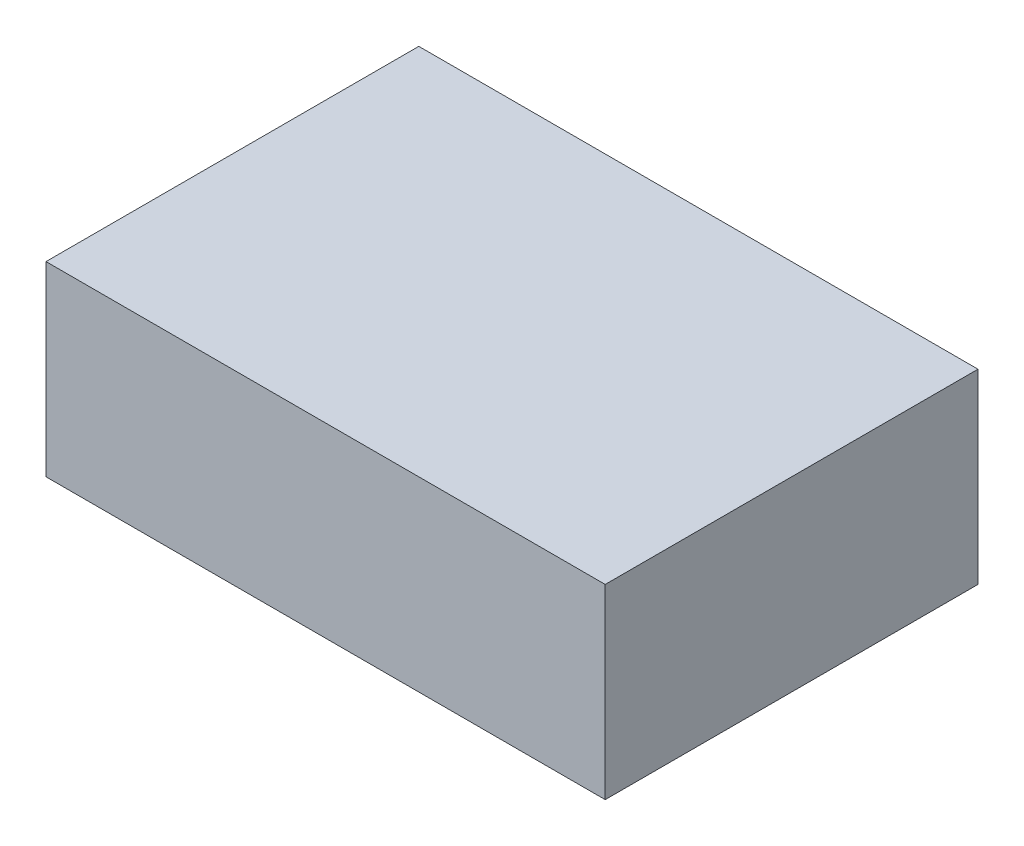
ISO-10303-21;
HEADER;
FILE_DESCRIPTION(('STEP AP214'),'2;1');
FILE_NAME('part.step','',(''),(''),'','','');
FILE_SCHEMA(('AUTOMOTIVE_DESIGN { 1 0 10303 214 1 1 1 1 }'));
ENDSEC;
DATA;
#1=APPLICATION_CONTEXT('core data for automotive mechanical design processes');
#2=APPLICATION_PROTOCOL_DEFINITION('international standard','automotive_design',2000,#1);
#3=PRODUCT_CONTEXT('',#1,'mechanical');
#4=PRODUCT('Part','Part','',(#3));
#5=PRODUCT_RELATED_PRODUCT_CATEGORY('part','',(#4));
#6=PRODUCT_DEFINITION_FORMATION('','',#4);
#7=PRODUCT_DEFINITION_CONTEXT('part definition',#1,'design');
#8=PRODUCT_DEFINITION('design','',#6,#7);
#9=PRODUCT_DEFINITION_SHAPE('','',#8);
#10=(LENGTH_UNIT() NAMED_UNIT(*) SI_UNIT(.MILLI.,.METRE.));
#11=(NAMED_UNIT(*) PLANE_ANGLE_UNIT() SI_UNIT($,.RADIAN.));
#12=(NAMED_UNIT(*) SI_UNIT($,.STERADIAN.) SOLID_ANGLE_UNIT());
#13=UNCERTAINTY_MEASURE_WITH_UNIT(LENGTH_MEASURE(1.E-05),#10,'distance_accuracy_value','');
#14=(GEOMETRIC_REPRESENTATION_CONTEXT(3) GLOBAL_UNCERTAINTY_ASSIGNED_CONTEXT((#13)) GLOBAL_UNIT_ASSIGNED_CONTEXT((#10,
#11,#12)) REPRESENTATION_CONTEXT('',''));
#15=CARTESIAN_POINT('',(0.,0.,0.));
#16=DIRECTION('',(0.,0.,1.));
#17=DIRECTION('',(1.,0.,0.));
#18=AXIS2_PLACEMENT_3D('',#15,#16,#17);
#19=CARTESIAN_POINT('',(15.,-5.,-20.));
#20=DIRECTION('',(1.,0.,0.));
#21=DIRECTION('',(0.,0.,-1.));
#22=AXIS2_PLACEMENT_3D('',#19,#20,#21);
#23=PLANE('',#22);
#24=DIRECTION('',(0.,1.,0.));
#25=VECTOR('',#24,1.);
#26=CARTESIAN_POINT('',(15.,-5.,0.));
#27=LINE('',#26,#25);
#28=CARTESIAN_POINT('',(15.,-5.,0.));
#29=VERTEX_POINT('',#28);
#30=CARTESIAN_POINT('',(15.,5.,0.));
#31=VERTEX_POINT('',#30);
#32=EDGE_CURVE('E98',#29,#31,#27,.T.);
#33=ORIENTED_EDGE('',*,*,#32,.F.);
#34=DIRECTION('',(0.,0.,1.));
#35=VECTOR('',#34,1.);
#36=CARTESIAN_POINT('',(15.,-5.,-20.));
#37=LINE('',#36,#35);
#38=CARTESIAN_POINT('',(15.,-5.,-20.));
#39=VERTEX_POINT('',#38);
#40=EDGE_CURVE('E11',#39,#29,#37,.T.);
#41=ORIENTED_EDGE('',*,*,#40,.F.);
#42=DIRECTION('',(0.,1.,0.));
#43=VECTOR('',#42,1.);
#44=CARTESIAN_POINT('',(15.,-5.,-20.));
#45=LINE('',#44,#43);
#46=CARTESIAN_POINT('',(15.,5.,-20.));
#47=VERTEX_POINT('',#46);
#48=EDGE_CURVE('E92',#39,#47,#45,.T.);
#49=ORIENTED_EDGE('',*,*,#48,.T.);
#50=DIRECTION('',(0.,0.,1.));
#51=VECTOR('',#50,1.);
#52=CARTESIAN_POINT('',(15.,5.,-20.));
#53=LINE('',#52,#51);
#54=EDGE_CURVE('E37',#47,#31,#53,.T.);
#55=ORIENTED_EDGE('',*,*,#54,.T.);
#56=EDGE_LOOP('',(#33,#41,#49,#55));
#57=FACE_BOUND('',#56,.T.);
#58=ADVANCED_FACE('F34',(#57),#23,.T.);
#59=CARTESIAN_POINT('',(-15.,-5.,-20.));
#60=DIRECTION('',(0.,-1.,0.));
#61=DIRECTION('',(0.,0.,-1.));
#62=AXIS2_PLACEMENT_3D('',#59,#60,#61);
#63=PLANE('',#62);
#64=DIRECTION('',(1.,0.,0.));
#65=VECTOR('',#64,1.);
#66=CARTESIAN_POINT('',(-15.,-5.,0.));
#67=LINE('',#66,#65);
#68=CARTESIAN_POINT('',(-15.,-5.,0.));
#69=VERTEX_POINT('',#68);
#70=EDGE_CURVE('E94',#69,#29,#67,.T.);
#71=ORIENTED_EDGE('',*,*,#70,.F.);
#72=DIRECTION('',(0.,0.,1.));
#73=VECTOR('',#72,1.);
#74=CARTESIAN_POINT('',(-15.,-5.,-20.));
#75=LINE('',#74,#73);
#76=CARTESIAN_POINT('',(-15.,-5.,-20.));
#77=VERTEX_POINT('',#76);
#78=EDGE_CURVE('E43',#77,#69,#75,.T.);
#79=ORIENTED_EDGE('',*,*,#78,.F.);
#80=DIRECTION('',(1.,0.,0.));
#81=VECTOR('',#80,1.);
#82=CARTESIAN_POINT('',(-15.,-5.,-20.));
#83=LINE('',#82,#81);
#84=EDGE_CURVE('E89',#77,#39,#83,.T.);
#85=ORIENTED_EDGE('',*,*,#84,.T.);
#86=ORIENTED_EDGE('',*,*,#40,.T.);
#87=EDGE_LOOP('',(#71,#79,#85,#86));
#88=FACE_BOUND('',#87,.T.);
#89=ADVANCED_FACE('F108',(#88),#63,.T.);
#90=CARTESIAN_POINT('',(-15.,-5.,-20.));
#91=DIRECTION('',(-1.,0.,0.));
#92=DIRECTION('',(0.,0.,1.));
#93=AXIS2_PLACEMENT_3D('',#90,#91,#92);
#94=PLANE('',#93);
#95=DIRECTION('',(0.,-1.,0.));
#96=VECTOR('',#95,1.);
#97=CARTESIAN_POINT('',(-15.,-5.,0.));
#98=LINE('',#97,#96);
#99=CARTESIAN_POINT('',(-15.,5.,0.));
#100=VERTEX_POINT('',#99);
#101=EDGE_CURVE('E84',#100,#69,#98,.T.);
#102=ORIENTED_EDGE('',*,*,#101,.F.);
#103=DIRECTION('',(0.,0.,1.));
#104=VECTOR('',#103,1.);
#105=CARTESIAN_POINT('',(-15.,5.,-20.));
#106=LINE('',#105,#104);
#107=CARTESIAN_POINT('',(-15.,5.,-20.));
#108=VERTEX_POINT('',#107);
#109=EDGE_CURVE('E79',#108,#100,#106,.T.);
#110=ORIENTED_EDGE('',*,*,#109,.F.);
#111=DIRECTION('',(0.,-1.,0.));
#112=VECTOR('',#111,1.);
#113=CARTESIAN_POINT('',(-15.,-5.,-20.));
#114=LINE('',#113,#112);
#115=EDGE_CURVE('E82',#108,#77,#114,.T.);
#116=ORIENTED_EDGE('',*,*,#115,.T.);
#117=ORIENTED_EDGE('',*,*,#78,.T.);
#118=EDGE_LOOP('',(#102,#110,#116,#117));
#119=FACE_BOUND('',#118,.T.);
#120=ADVANCED_FACE('F81',(#119),#94,.T.);
#121=CARTESIAN_POINT('',(-15.,5.,-20.));
#122=DIRECTION('',(0.,1.,0.));
#123=DIRECTION('',(0.,0.,1.));
#124=AXIS2_PLACEMENT_3D('',#121,#122,#123);
#125=PLANE('',#124);
#126=DIRECTION('',(-1.,0.,0.));
#127=VECTOR('',#126,1.);
#128=CARTESIAN_POINT('',(-15.,5.,0.));
#129=LINE('',#128,#127);
#130=EDGE_CURVE('E101',#31,#100,#129,.T.);
#131=ORIENTED_EDGE('',*,*,#130,.F.);
#132=ORIENTED_EDGE('',*,*,#54,.F.);
#133=DIRECTION('',(-1.,0.,0.));
#134=VECTOR('',#133,1.);
#135=CARTESIAN_POINT('',(-15.,5.,-20.));
#136=LINE('',#135,#134);
#137=EDGE_CURVE('E88',#47,#108,#136,.T.);
#138=ORIENTED_EDGE('',*,*,#137,.T.);
#139=ORIENTED_EDGE('',*,*,#109,.T.);
#140=EDGE_LOOP('',(#131,#132,#138,#139));
#141=FACE_BOUND('',#140,.T.);
#142=ADVANCED_FACE('F91',(#141),#125,.T.);
#143=CARTESIAN_POINT('',(0.,0.,-20.));
#144=DIRECTION('',(0.,0.,-1.));
#145=DIRECTION('',(-1.,0.,0.));
#146=AXIS2_PLACEMENT_3D('',#143,#144,#145);
#147=PLANE('',#146);
#148=ORIENTED_EDGE('',*,*,#48,.F.);
#149=ORIENTED_EDGE('',*,*,#84,.F.);
#150=ORIENTED_EDGE('',*,*,#115,.F.);
#151=ORIENTED_EDGE('',*,*,#137,.F.);
#152=EDGE_LOOP('',(#148,#149,#150,#151));
#153=FACE_BOUND('',#152,.T.);
#154=ADVANCED_FACE('F87',(#153),#147,.T.);
#155=CARTESIAN_POINT('',(0.,0.,0.));
#156=DIRECTION('',(0.,0.,-1.));
#157=DIRECTION('',(-1.,0.,0.));
#158=AXIS2_PLACEMENT_3D('',#155,#156,#157);
#159=PLANE('',#158);
#160=ORIENTED_EDGE('',*,*,#32,.T.);
#161=ORIENTED_EDGE('',*,*,#130,.T.);
#162=ORIENTED_EDGE('',*,*,#101,.T.);
#163=ORIENTED_EDGE('',*,*,#70,.T.);
#164=EDGE_LOOP('',(#160,#161,#162,#163));
#165=FACE_BOUND('',#164,.T.);
#166=ADVANCED_FACE('F107',(#165),#159,.F.);
#167=CLOSED_SHELL('',(#58,#89,#120,#142,#154,#166));
#168=MANIFOLD_SOLID_BREP('B2',#167);
#169=ADVANCED_BREP_SHAPE_REPRESENTATION('',(#18,#168),#14);
#170=SHAPE_DEFINITION_REPRESENTATION(#9,#169);
ENDSEC;
END-ISO-10303-21;
